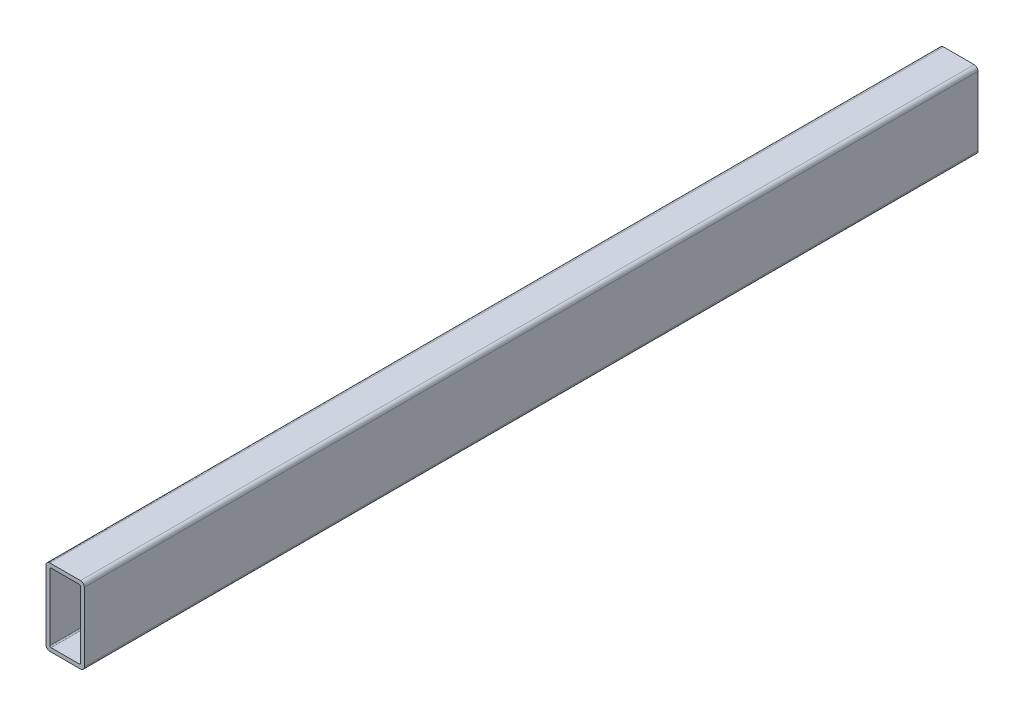
ISO-10303-21;
HEADER;
FILE_DESCRIPTION(('STEP AP214'),'2;1');
FILE_NAME('part.step','',(''),(''),'','','');
FILE_SCHEMA(('AUTOMOTIVE_DESIGN { 1 0 10303 214 1 1 1 1 }'));
ENDSEC;
DATA;
#1=APPLICATION_CONTEXT('core data for automotive mechanical design processes');
#2=APPLICATION_PROTOCOL_DEFINITION('international standard','automotive_design',2000,#1);
#3=PRODUCT_CONTEXT('',#1,'mechanical');
#4=PRODUCT('Part','Part','',(#3));
#5=PRODUCT_RELATED_PRODUCT_CATEGORY('part','',(#4));
#6=PRODUCT_DEFINITION_FORMATION('','',#4);
#7=PRODUCT_DEFINITION_CONTEXT('part definition',#1,'design');
#8=PRODUCT_DEFINITION('design','',#6,#7);
#9=PRODUCT_DEFINITION_SHAPE('','',#8);
#10=(LENGTH_UNIT() NAMED_UNIT(*) SI_UNIT(.MILLI.,.METRE.));
#11=(NAMED_UNIT(*) PLANE_ANGLE_UNIT() SI_UNIT($,.RADIAN.));
#12=(NAMED_UNIT(*) SI_UNIT($,.STERADIAN.) SOLID_ANGLE_UNIT());
#13=UNCERTAINTY_MEASURE_WITH_UNIT(LENGTH_MEASURE(1.E-05),#10,'distance_accuracy_value','');
#14=(GEOMETRIC_REPRESENTATION_CONTEXT(3) GLOBAL_UNCERTAINTY_ASSIGNED_CONTEXT((#13)) GLOBAL_UNIT_ASSIGNED_CONTEXT((#10,
#11,#12)) REPRESENTATION_CONTEXT('',''));
#15=CARTESIAN_POINT('',(0.,0.,0.));
#16=DIRECTION('',(0.,0.,1.));
#17=DIRECTION('',(1.,0.,0.));
#18=AXIS2_PLACEMENT_3D('',#15,#16,#17);
#19=CARTESIAN_POINT('',(12.,-2.99999999999999,-700.));
#20=DIRECTION('',(0.,0.,1.));
#21=DIRECTION('',(1.,0.,0.));
#22=AXIS2_PLACEMENT_3D('',#19,#20,#21);
#23=CYLINDRICAL_SURFACE('',#22,2.99999999999999);
#24=CARTESIAN_POINT('',(12.,-2.99999999999999,0.));
#25=DIRECTION('',(0.,0.,1.));
#26=DIRECTION('',(-1.,0.,0.));
#27=AXIS2_PLACEMENT_3D('',#24,#25,#26);
#28=CIRCLE('',#27,2.99999999999999);
#29=CARTESIAN_POINT('',(15.,-2.99999999999999,0.));
#30=VERTEX_POINT('',#29);
#31=CARTESIAN_POINT('',(12.,0.,0.));
#32=VERTEX_POINT('',#31);
#33=EDGE_CURVE('E227',#30,#32,#28,.T.);
#34=ORIENTED_EDGE('',*,*,#33,.F.);
#35=DIRECTION('',(0.,0.,1.));
#36=VECTOR('',#35,1.);
#37=CARTESIAN_POINT('',(15.,-2.99999999999999,-700.));
#38=LINE('',#37,#36);
#39=CARTESIAN_POINT('',(15.,-2.99999999999999,-700.));
#40=VERTEX_POINT('',#39);
#41=EDGE_CURVE('E11',#40,#30,#38,.T.);
#42=ORIENTED_EDGE('',*,*,#41,.F.);
#43=CARTESIAN_POINT('',(12.,-2.99999999999999,-700.));
#44=DIRECTION('',(0.,0.,1.));
#45=DIRECTION('',(-1.,0.,0.));
#46=AXIS2_PLACEMENT_3D('',#43,#44,#45);
#47=CIRCLE('',#46,2.99999999999999);
#48=CARTESIAN_POINT('',(12.,0.,-700.));
#49=VERTEX_POINT('',#48);
#50=EDGE_CURVE('E245',#40,#49,#47,.T.);
#51=ORIENTED_EDGE('',*,*,#50,.T.);
#52=DIRECTION('',(0.,0.,1.));
#53=VECTOR('',#52,1.);
#54=CARTESIAN_POINT('',(12.,0.,-700.));
#55=LINE('',#54,#53);
#56=EDGE_CURVE('E41',#49,#32,#55,.T.);
#57=ORIENTED_EDGE('',*,*,#56,.T.);
#58=EDGE_LOOP('',(#34,#42,#51,#57));
#59=FACE_BOUND('',#58,.T.);
#60=ADVANCED_FACE('F38',(#59),#23,.T.);
#61=CARTESIAN_POINT('',(15.,-57.,-700.));
#62=DIRECTION('',(1.,0.,0.));
#63=DIRECTION('',(0.,0.,-1.));
#64=AXIS2_PLACEMENT_3D('',#61,#62,#63);
#65=PLANE('',#64);
#66=DIRECTION('',(0.,1.,0.));
#67=VECTOR('',#66,1.);
#68=CARTESIAN_POINT('',(15.,-57.,0.));
#69=LINE('',#68,#67);
#70=CARTESIAN_POINT('',(15.,-57.,0.));
#71=VERTEX_POINT('',#70);
#72=EDGE_CURVE('E250',#71,#30,#69,.T.);
#73=ORIENTED_EDGE('',*,*,#72,.F.);
#74=DIRECTION('',(0.,0.,1.));
#75=VECTOR('',#74,1.);
#76=CARTESIAN_POINT('',(15.,-57.,-700.));
#77=LINE('',#76,#75);
#78=CARTESIAN_POINT('',(15.,-57.,-700.));
#79=VERTEX_POINT('',#78);
#80=EDGE_CURVE('E47',#79,#71,#77,.T.);
#81=ORIENTED_EDGE('',*,*,#80,.F.);
#82=DIRECTION('',(0.,1.,0.));
#83=VECTOR('',#82,1.);
#84=CARTESIAN_POINT('',(15.,-57.,-700.));
#85=LINE('',#84,#83);
#86=EDGE_CURVE('E274',#79,#40,#85,.T.);
#87=ORIENTED_EDGE('',*,*,#86,.T.);
#88=ORIENTED_EDGE('',*,*,#41,.T.);
#89=EDGE_LOOP('',(#73,#81,#87,#88));
#90=FACE_BOUND('',#89,.T.);
#91=ADVANCED_FACE('F337',(#90),#65,.T.);
#92=CARTESIAN_POINT('',(12.,-57.,-700.));
#93=DIRECTION('',(0.,0.,1.));
#94=DIRECTION('',(1.,0.,0.));
#95=AXIS2_PLACEMENT_3D('',#92,#93,#94);
#96=CYLINDRICAL_SURFACE('',#95,3.);
#97=CARTESIAN_POINT('',(12.,-57.,0.));
#98=DIRECTION('',(0.,0.,1.));
#99=DIRECTION('',(-1.,0.,0.));
#100=AXIS2_PLACEMENT_3D('',#97,#98,#99);
#101=CIRCLE('',#100,3.);
#102=CARTESIAN_POINT('',(12.,-60.,0.));
#103=VERTEX_POINT('',#102);
#104=EDGE_CURVE('E301',#103,#71,#101,.T.);
#105=ORIENTED_EDGE('',*,*,#104,.F.);
#106=DIRECTION('',(0.,0.,1.));
#107=VECTOR('',#106,1.);
#108=CARTESIAN_POINT('',(12.,-60.,-700.));
#109=LINE('',#108,#107);
#110=CARTESIAN_POINT('',(12.,-60.,-700.));
#111=VERTEX_POINT('',#110);
#112=EDGE_CURVE('E310',#111,#103,#109,.T.);
#113=ORIENTED_EDGE('',*,*,#112,.F.);
#114=CARTESIAN_POINT('',(12.,-57.,-700.));
#115=DIRECTION('',(0.,0.,1.));
#116=DIRECTION('',(-1.,0.,0.));
#117=AXIS2_PLACEMENT_3D('',#114,#115,#116);
#118=CIRCLE('',#117,3.);
#119=EDGE_CURVE('E270',#111,#79,#118,.T.);
#120=ORIENTED_EDGE('',*,*,#119,.T.);
#121=ORIENTED_EDGE('',*,*,#80,.T.);
#122=EDGE_LOOP('',(#105,#113,#120,#121));
#123=FACE_BOUND('',#122,.T.);
#124=ADVANCED_FACE('F356',(#123),#96,.T.);
#125=CARTESIAN_POINT('',(-12.,-60.,-700.));
#126=DIRECTION('',(0.,-1.,0.));
#127=DIRECTION('',(0.,0.,-1.));
#128=AXIS2_PLACEMENT_3D('',#125,#126,#127);
#129=PLANE('',#128);
#130=DIRECTION('',(1.,0.,0.));
#131=VECTOR('',#130,1.);
#132=CARTESIAN_POINT('',(-12.,-60.,0.));
#133=LINE('',#132,#131);
#134=CARTESIAN_POINT('',(-12.,-60.,0.));
#135=VERTEX_POINT('',#134);
#136=EDGE_CURVE('E297',#135,#103,#133,.T.);
#137=ORIENTED_EDGE('',*,*,#136,.F.);
#138=DIRECTION('',(0.,0.,1.));
#139=VECTOR('',#138,1.);
#140=CARTESIAN_POINT('',(-12.,-60.,-700.));
#141=LINE('',#140,#139);
#142=CARTESIAN_POINT('',(-12.,-60.,-700.));
#143=VERTEX_POINT('',#142);
#144=EDGE_CURVE('E313',#143,#135,#141,.T.);
#145=ORIENTED_EDGE('',*,*,#144,.F.);
#146=DIRECTION('',(1.,0.,0.));
#147=VECTOR('',#146,1.);
#148=CARTESIAN_POINT('',(-12.,-60.,-700.));
#149=LINE('',#148,#147);
#150=EDGE_CURVE('E266',#143,#111,#149,.T.);
#151=ORIENTED_EDGE('',*,*,#150,.T.);
#152=ORIENTED_EDGE('',*,*,#112,.T.);
#153=EDGE_LOOP('',(#137,#145,#151,#152));
#154=FACE_BOUND('',#153,.T.);
#155=ADVANCED_FACE('F354',(#154),#129,.T.);
#156=CARTESIAN_POINT('',(-12.,-57.,-700.));
#157=DIRECTION('',(0.,0.,1.));
#158=DIRECTION('',(1.,0.,0.));
#159=AXIS2_PLACEMENT_3D('',#156,#157,#158);
#160=CYLINDRICAL_SURFACE('',#159,3.);
#161=CARTESIAN_POINT('',(-12.,-57.,0.));
#162=DIRECTION('',(0.,0.,1.));
#163=DIRECTION('',(-1.,0.,0.));
#164=AXIS2_PLACEMENT_3D('',#161,#162,#163);
#165=CIRCLE('',#164,3.);
#166=CARTESIAN_POINT('',(-15.,-57.,0.));
#167=VERTEX_POINT('',#166);
#168=EDGE_CURVE('E293',#167,#135,#165,.T.);
#169=ORIENTED_EDGE('',*,*,#168,.F.);
#170=DIRECTION('',(0.,0.,1.));
#171=VECTOR('',#170,1.);
#172=CARTESIAN_POINT('',(-15.,-57.,-700.));
#173=LINE('',#172,#171);
#174=CARTESIAN_POINT('',(-15.,-57.,-700.));
#175=VERTEX_POINT('',#174);
#176=EDGE_CURVE('E316',#175,#167,#173,.T.);
#177=ORIENTED_EDGE('',*,*,#176,.F.);
#178=CARTESIAN_POINT('',(-12.,-57.,-700.));
#179=DIRECTION('',(0.,0.,1.));
#180=DIRECTION('',(-1.,0.,0.));
#181=AXIS2_PLACEMENT_3D('',#178,#179,#180);
#182=CIRCLE('',#181,3.);
#183=EDGE_CURVE('E262',#175,#143,#182,.T.);
#184=ORIENTED_EDGE('',*,*,#183,.T.);
#185=ORIENTED_EDGE('',*,*,#144,.T.);
#186=EDGE_LOOP('',(#169,#177,#184,#185));
#187=FACE_BOUND('',#186,.T.);
#188=ADVANCED_FACE('F350',(#187),#160,.T.);
#189=CARTESIAN_POINT('',(-15.,-57.,-700.));
#190=DIRECTION('',(-1.,0.,0.));
#191=DIRECTION('',(0.,-1.,0.));
#192=AXIS2_PLACEMENT_3D('',#189,#190,#191);
#193=PLANE('',#192);
#194=DIRECTION('',(0.,-1.,0.));
#195=VECTOR('',#194,1.);
#196=CARTESIAN_POINT('',(-15.,-57.,0.));
#197=LINE('',#196,#195);
#198=CARTESIAN_POINT('',(-15.,-2.99999999999999,0.));
#199=VERTEX_POINT('',#198);
#200=EDGE_CURVE('E289',#199,#167,#197,.T.);
#201=ORIENTED_EDGE('',*,*,#200,.F.);
#202=DIRECTION('',(0.,0.,1.));
#203=VECTOR('',#202,1.);
#204=CARTESIAN_POINT('',(-15.,-2.99999999999999,-700.));
#205=LINE('',#204,#203);
#206=CARTESIAN_POINT('',(-15.,-2.99999999999999,-700.));
#207=VERTEX_POINT('',#206);
#208=EDGE_CURVE('E319',#207,#199,#205,.T.);
#209=ORIENTED_EDGE('',*,*,#208,.F.);
#210=DIRECTION('',(0.,-1.,0.));
#211=VECTOR('',#210,1.);
#212=CARTESIAN_POINT('',(-15.,-57.,-700.));
#213=LINE('',#212,#211);
#214=EDGE_CURVE('E258',#207,#175,#213,.T.);
#215=ORIENTED_EDGE('',*,*,#214,.T.);
#216=ORIENTED_EDGE('',*,*,#176,.T.);
#217=EDGE_LOOP('',(#201,#209,#215,#216));
#218=FACE_BOUND('',#217,.T.);
#219=ADVANCED_FACE('F348',(#218),#193,.T.);
#220=CARTESIAN_POINT('',(-12.,-2.99999999999999,-700.));
#221=DIRECTION('',(0.,0.,1.));
#222=DIRECTION('',(1.,0.,0.));
#223=AXIS2_PLACEMENT_3D('',#220,#221,#222);
#224=CYLINDRICAL_SURFACE('',#223,2.99999999999999);
#225=CARTESIAN_POINT('',(-12.,-2.99999999999999,0.));
#226=DIRECTION('',(0.,0.,1.));
#227=DIRECTION('',(-1.,0.,0.));
#228=AXIS2_PLACEMENT_3D('',#225,#226,#227);
#229=CIRCLE('',#228,2.99999999999999);
#230=CARTESIAN_POINT('',(-12.,0.,0.));
#231=VERTEX_POINT('',#230);
#232=EDGE_CURVE('E285',#231,#199,#229,.T.);
#233=ORIENTED_EDGE('',*,*,#232,.F.);
#234=DIRECTION('',(0.,0.,1.));
#235=VECTOR('',#234,1.);
#236=CARTESIAN_POINT('',(-12.,0.,-700.));
#237=LINE('',#236,#235);
#238=CARTESIAN_POINT('',(-12.,0.,-700.));
#239=VERTEX_POINT('',#238);
#240=EDGE_CURVE('E321',#239,#231,#237,.T.);
#241=ORIENTED_EDGE('',*,*,#240,.F.);
#242=CARTESIAN_POINT('',(-12.,-2.99999999999999,-700.));
#243=DIRECTION('',(0.,0.,1.));
#244=DIRECTION('',(-1.,0.,0.));
#245=AXIS2_PLACEMENT_3D('',#242,#243,#244);
#246=CIRCLE('',#245,2.99999999999999);
#247=EDGE_CURVE('E254',#239,#207,#246,.T.);
#248=ORIENTED_EDGE('',*,*,#247,.T.);
#249=ORIENTED_EDGE('',*,*,#208,.T.);
#250=EDGE_LOOP('',(#233,#241,#248,#249));
#251=FACE_BOUND('',#250,.T.);
#252=ADVANCED_FACE('F344',(#251),#224,.T.);
#253=CARTESIAN_POINT('',(-12.,0.,-700.));
#254=DIRECTION('',(0.,1.,0.));
#255=DIRECTION('',(0.,0.,1.));
#256=AXIS2_PLACEMENT_3D('',#253,#254,#255);
#257=PLANE('',#256);
#258=DIRECTION('',(-1.,0.,0.));
#259=VECTOR('',#258,1.);
#260=CARTESIAN_POINT('',(-12.,0.,0.));
#261=LINE('',#260,#259);
#262=EDGE_CURVE('E281',#32,#231,#261,.T.);
#263=ORIENTED_EDGE('',*,*,#262,.F.);
#264=ORIENTED_EDGE('',*,*,#56,.F.);
#265=DIRECTION('',(-1.,0.,0.));
#266=VECTOR('',#265,1.);
#267=CARTESIAN_POINT('',(-12.,0.,-700.));
#268=LINE('',#267,#266);
#269=EDGE_CURVE('E249',#49,#239,#268,.T.);
#270=ORIENTED_EDGE('',*,*,#269,.T.);
#271=ORIENTED_EDGE('',*,*,#240,.T.);
#272=EDGE_LOOP('',(#263,#264,#270,#271));
#273=FACE_BOUND('',#272,.T.);
#274=ADVANCED_FACE('F331',(#273),#257,.T.);
#275=CARTESIAN_POINT('',(12.,-2.99999999999999,-700.));
#276=DIRECTION('',(0.,0.,-1.));
#277=DIRECTION('',(-1.,0.,0.));
#278=AXIS2_PLACEMENT_3D('',#275,#276,#277);
#279=PLANE('',#278);
#280=CARTESIAN_POINT('',(11.,-4.,-700.));
#281=DIRECTION('',(0.,0.,1.));
#282=DIRECTION('',(-1.,0.,0.));
#283=AXIS2_PLACEMENT_3D('',#280,#281,#282);
#284=CIRCLE('',#283,1.);
#285=CARTESIAN_POINT('',(12.,-4.,-700.));
#286=VERTEX_POINT('',#285);
#287=CARTESIAN_POINT('',(11.,-3.,-700.));
#288=VERTEX_POINT('',#287);
#289=EDGE_CURVE('E154',#286,#288,#284,.T.);
#290=ORIENTED_EDGE('',*,*,#289,.T.);
#291=DIRECTION('',(-1.,0.,0.));
#292=VECTOR('',#291,1.);
#293=CARTESIAN_POINT('',(-11.,-3.,-700.));
#294=LINE('',#293,#292);
#295=CARTESIAN_POINT('',(-11.,-3.,-700.));
#296=VERTEX_POINT('',#295);
#297=EDGE_CURVE('E164',#288,#296,#294,.T.);
#298=ORIENTED_EDGE('',*,*,#297,.T.);
#299=CARTESIAN_POINT('',(-11.,-4.,-700.));
#300=DIRECTION('',(0.,0.,1.));
#301=DIRECTION('',(-1.,0.,0.));
#302=AXIS2_PLACEMENT_3D('',#299,#300,#301);
#303=CIRCLE('',#302,1.);
#304=CARTESIAN_POINT('',(-12.,-4.,-700.));
#305=VERTEX_POINT('',#304);
#306=EDGE_CURVE('E55',#296,#305,#303,.T.);
#307=ORIENTED_EDGE('',*,*,#306,.T.);
#308=DIRECTION('',(0.,-1.,0.));
#309=VECTOR('',#308,1.);
#310=CARTESIAN_POINT('',(-12.,-56.,-700.));
#311=LINE('',#310,#309);
#312=CARTESIAN_POINT('',(-12.,-56.,-700.));
#313=VERTEX_POINT('',#312);
#314=EDGE_CURVE('E183',#305,#313,#311,.T.);
#315=ORIENTED_EDGE('',*,*,#314,.T.);
#316=CARTESIAN_POINT('',(-11.,-56.,-700.));
#317=DIRECTION('',(0.,0.,1.));
#318=DIRECTION('',(-1.,0.,0.));
#319=AXIS2_PLACEMENT_3D('',#316,#317,#318);
#320=CIRCLE('',#319,1.);
#321=CARTESIAN_POINT('',(-11.,-57.,-700.));
#322=VERTEX_POINT('',#321);
#323=EDGE_CURVE('E187',#313,#322,#320,.T.);
#324=ORIENTED_EDGE('',*,*,#323,.T.);
#325=DIRECTION('',(1.,0.,0.));
#326=VECTOR('',#325,1.);
#327=CARTESIAN_POINT('',(-11.,-57.,-700.));
#328=LINE('',#327,#326);
#329=CARTESIAN_POINT('',(11.,-57.,-700.));
#330=VERTEX_POINT('',#329);
#331=EDGE_CURVE('E191',#322,#330,#328,.T.);
#332=ORIENTED_EDGE('',*,*,#331,.T.);
#333=CARTESIAN_POINT('',(11.,-56.,-700.));
#334=DIRECTION('',(0.,0.,1.));
#335=DIRECTION('',(-1.,0.,0.));
#336=AXIS2_PLACEMENT_3D('',#333,#334,#335);
#337=CIRCLE('',#336,1.);
#338=CARTESIAN_POINT('',(12.,-56.,-700.));
#339=VERTEX_POINT('',#338);
#340=EDGE_CURVE('E195',#330,#339,#337,.T.);
#341=ORIENTED_EDGE('',*,*,#340,.T.);
#342=DIRECTION('',(0.,1.,0.));
#343=VECTOR('',#342,1.);
#344=CARTESIAN_POINT('',(12.,-56.,-700.));
#345=LINE('',#344,#343);
#346=EDGE_CURVE('E161',#339,#286,#345,.T.);
#347=ORIENTED_EDGE('',*,*,#346,.T.);
#348=EDGE_LOOP('',(#290,#298,#307,#315,#324,#332,#341,#347));
#349=FACE_BOUND('',#348,.T.);
#350=ORIENTED_EDGE('',*,*,#50,.F.);
#351=ORIENTED_EDGE('',*,*,#86,.F.);
#352=ORIENTED_EDGE('',*,*,#119,.F.);
#353=ORIENTED_EDGE('',*,*,#150,.F.);
#354=ORIENTED_EDGE('',*,*,#183,.F.);
#355=ORIENTED_EDGE('',*,*,#214,.F.);
#356=ORIENTED_EDGE('',*,*,#247,.F.);
#357=ORIENTED_EDGE('',*,*,#269,.F.);
#358=EDGE_LOOP('',(#350,#351,#352,#353,#354,#355,#356,#357));
#359=FACE_BOUND('',#358,.T.);
#360=ADVANCED_FACE('F169',(#349,#359),#279,.T.);
#361=CARTESIAN_POINT('',(12.,-2.99999999999999,0.));
#362=DIRECTION('',(0.,0.,-1.));
#363=DIRECTION('',(-1.,0.,0.));
#364=AXIS2_PLACEMENT_3D('',#361,#362,#363);
#365=PLANE('',#364);
#366=DIRECTION('',(-1.,0.,0.));
#367=VECTOR('',#366,1.);
#368=CARTESIAN_POINT('',(-11.,-3.,0.));
#369=LINE('',#368,#367);
#370=CARTESIAN_POINT('',(11.,-3.,0.));
#371=VERTEX_POINT('',#370);
#372=CARTESIAN_POINT('',(-11.,-3.,0.));
#373=VERTEX_POINT('',#372);
#374=EDGE_CURVE('E202',#371,#373,#369,.T.);
#375=ORIENTED_EDGE('',*,*,#374,.F.);
#376=CARTESIAN_POINT('',(11.,-4.,0.));
#377=DIRECTION('',(0.,0.,1.));
#378=DIRECTION('',(-1.,0.,0.));
#379=AXIS2_PLACEMENT_3D('',#376,#377,#378);
#380=CIRCLE('',#379,1.);
#381=CARTESIAN_POINT('',(12.,-4.,0.));
#382=VERTEX_POINT('',#381);
#383=EDGE_CURVE('E63',#382,#371,#380,.T.);
#384=ORIENTED_EDGE('',*,*,#383,.F.);
#385=DIRECTION('',(0.,1.,0.));
#386=VECTOR('',#385,1.);
#387=CARTESIAN_POINT('',(12.,-56.,0.));
#388=LINE('',#387,#386);
#389=CARTESIAN_POINT('',(12.,-56.,0.));
#390=VERTEX_POINT('',#389);
#391=EDGE_CURVE('E174',#390,#382,#388,.T.);
#392=ORIENTED_EDGE('',*,*,#391,.F.);
#393=CARTESIAN_POINT('',(11.,-56.,0.));
#394=DIRECTION('',(0.,0.,1.));
#395=DIRECTION('',(-1.,0.,0.));
#396=AXIS2_PLACEMENT_3D('',#393,#394,#395);
#397=CIRCLE('',#396,1.);
#398=CARTESIAN_POINT('',(11.,-57.,0.));
#399=VERTEX_POINT('',#398);
#400=EDGE_CURVE('E178',#399,#390,#397,.T.);
#401=ORIENTED_EDGE('',*,*,#400,.F.);
#402=DIRECTION('',(1.,0.,0.));
#403=VECTOR('',#402,1.);
#404=CARTESIAN_POINT('',(-11.,-57.,0.));
#405=LINE('',#404,#403);
#406=CARTESIAN_POINT('',(-11.,-57.,0.));
#407=VERTEX_POINT('',#406);
#408=EDGE_CURVE('E217',#407,#399,#405,.T.);
#409=ORIENTED_EDGE('',*,*,#408,.F.);
#410=CARTESIAN_POINT('',(-11.,-56.,0.));
#411=DIRECTION('',(0.,0.,1.));
#412=DIRECTION('',(-1.,0.,0.));
#413=AXIS2_PLACEMENT_3D('',#410,#411,#412);
#414=CIRCLE('',#413,1.);
#415=CARTESIAN_POINT('',(-12.,-56.,0.));
#416=VERTEX_POINT('',#415);
#417=EDGE_CURVE('E213',#416,#407,#414,.T.);
#418=ORIENTED_EDGE('',*,*,#417,.F.);
#419=DIRECTION('',(0.,-1.,0.));
#420=VECTOR('',#419,1.);
#421=CARTESIAN_POINT('',(-12.,-56.,0.));
#422=LINE('',#421,#420);
#423=CARTESIAN_POINT('',(-12.,-4.,0.));
#424=VERTEX_POINT('',#423);
#425=EDGE_CURVE('E209',#424,#416,#422,.T.);
#426=ORIENTED_EDGE('',*,*,#425,.F.);
#427=CARTESIAN_POINT('',(-11.,-4.,0.));
#428=DIRECTION('',(0.,0.,1.));
#429=DIRECTION('',(-1.,0.,0.));
#430=AXIS2_PLACEMENT_3D('',#427,#428,#429);
#431=CIRCLE('',#430,1.);
#432=EDGE_CURVE('E205',#373,#424,#431,.T.);
#433=ORIENTED_EDGE('',*,*,#432,.F.);
#434=EDGE_LOOP('',(#375,#384,#392,#401,#409,#418,#426,#433));
#435=FACE_BOUND('',#434,.T.);
#436=ORIENTED_EDGE('',*,*,#33,.T.);
#437=ORIENTED_EDGE('',*,*,#262,.T.);
#438=ORIENTED_EDGE('',*,*,#232,.T.);
#439=ORIENTED_EDGE('',*,*,#200,.T.);
#440=ORIENTED_EDGE('',*,*,#168,.T.);
#441=ORIENTED_EDGE('',*,*,#136,.T.);
#442=ORIENTED_EDGE('',*,*,#104,.T.);
#443=ORIENTED_EDGE('',*,*,#72,.T.);
#444=EDGE_LOOP('',(#436,#437,#438,#439,#440,#441,#442,#443));
#445=FACE_BOUND('',#444,.T.);
#446=ADVANCED_FACE('F333',(#435,#445),#365,.F.);
#447=CARTESIAN_POINT('',(11.,-4.,-700.));
#448=DIRECTION('',(0.,0.,1.));
#449=DIRECTION('',(1.,0.,0.));
#450=AXIS2_PLACEMENT_3D('',#447,#448,#449);
#451=CYLINDRICAL_SURFACE('',#450,1.);
#452=ORIENTED_EDGE('',*,*,#383,.T.);
#453=DIRECTION('',(0.,0.,1.));
#454=VECTOR('',#453,1.);
#455=CARTESIAN_POINT('',(11.,-3.,-700.));
#456=LINE('',#455,#454);
#457=EDGE_CURVE('E150',#288,#371,#456,.T.);
#458=ORIENTED_EDGE('',*,*,#457,.F.);
#459=ORIENTED_EDGE('',*,*,#289,.F.);
#460=DIRECTION('',(0.,0.,1.));
#461=VECTOR('',#460,1.);
#462=CARTESIAN_POINT('',(12.,-4.,-700.));
#463=LINE('',#462,#461);
#464=EDGE_CURVE('E224',#286,#382,#463,.T.);
#465=ORIENTED_EDGE('',*,*,#464,.T.);
#466=EDGE_LOOP('',(#452,#458,#459,#465));
#467=FACE_BOUND('',#466,.T.);
#468=ADVANCED_FACE('F152',(#467),#451,.F.);
#469=CARTESIAN_POINT('',(12.,-56.,-700.));
#470=DIRECTION('',(1.,0.,0.));
#471=DIRECTION('',(0.,1.,0.));
#472=AXIS2_PLACEMENT_3D('',#469,#470,#471);
#473=PLANE('',#472);
#474=ORIENTED_EDGE('',*,*,#391,.T.);
#475=ORIENTED_EDGE('',*,*,#464,.F.);
#476=ORIENTED_EDGE('',*,*,#346,.F.);
#477=DIRECTION('',(0.,0.,1.));
#478=VECTOR('',#477,1.);
#479=CARTESIAN_POINT('',(12.,-56.,-700.));
#480=LINE('',#479,#478);
#481=EDGE_CURVE('E228',#339,#390,#480,.T.);
#482=ORIENTED_EDGE('',*,*,#481,.T.);
#483=EDGE_LOOP('',(#474,#475,#476,#482));
#484=FACE_BOUND('',#483,.T.);
#485=ADVANCED_FACE('F439',(#484),#473,.F.);
#486=CARTESIAN_POINT('',(11.,-56.,-700.));
#487=DIRECTION('',(0.,0.,1.));
#488=DIRECTION('',(1.,0.,0.));
#489=AXIS2_PLACEMENT_3D('',#486,#487,#488);
#490=CYLINDRICAL_SURFACE('',#489,1.);
#491=ORIENTED_EDGE('',*,*,#400,.T.);
#492=ORIENTED_EDGE('',*,*,#481,.F.);
#493=ORIENTED_EDGE('',*,*,#340,.F.);
#494=DIRECTION('',(0.,0.,1.));
#495=VECTOR('',#494,1.);
#496=CARTESIAN_POINT('',(11.,-57.,-700.));
#497=LINE('',#496,#495);
#498=EDGE_CURVE('E231',#330,#399,#497,.T.);
#499=ORIENTED_EDGE('',*,*,#498,.T.);
#500=EDGE_LOOP('',(#491,#492,#493,#499));
#501=FACE_BOUND('',#500,.T.);
#502=ADVANCED_FACE('F448',(#501),#490,.F.);
#503=CARTESIAN_POINT('',(-11.,-57.,-700.));
#504=DIRECTION('',(0.,-1.,0.));
#505=DIRECTION('',(0.,0.,-1.));
#506=AXIS2_PLACEMENT_3D('',#503,#504,#505);
#507=PLANE('',#506);
#508=ORIENTED_EDGE('',*,*,#408,.T.);
#509=ORIENTED_EDGE('',*,*,#498,.F.);
#510=ORIENTED_EDGE('',*,*,#331,.F.);
#511=DIRECTION('',(0.,0.,1.));
#512=VECTOR('',#511,1.);
#513=CARTESIAN_POINT('',(-11.,-57.,-700.));
#514=LINE('',#513,#512);
#515=EDGE_CURVE('E234',#322,#407,#514,.T.);
#516=ORIENTED_EDGE('',*,*,#515,.T.);
#517=EDGE_LOOP('',(#508,#509,#510,#516));
#518=FACE_BOUND('',#517,.T.);
#519=ADVANCED_FACE('F458',(#518),#507,.F.);
#520=CARTESIAN_POINT('',(-11.,-56.,-700.));
#521=DIRECTION('',(0.,0.,1.));
#522=DIRECTION('',(1.,0.,0.));
#523=AXIS2_PLACEMENT_3D('',#520,#521,#522);
#524=CYLINDRICAL_SURFACE('',#523,1.);
#525=ORIENTED_EDGE('',*,*,#417,.T.);
#526=ORIENTED_EDGE('',*,*,#515,.F.);
#527=ORIENTED_EDGE('',*,*,#323,.F.);
#528=DIRECTION('',(0.,0.,1.));
#529=VECTOR('',#528,1.);
#530=CARTESIAN_POINT('',(-12.,-56.,-700.));
#531=LINE('',#530,#529);
#532=EDGE_CURVE('E237',#313,#416,#531,.T.);
#533=ORIENTED_EDGE('',*,*,#532,.T.);
#534=EDGE_LOOP('',(#525,#526,#527,#533));
#535=FACE_BOUND('',#534,.T.);
#536=ADVANCED_FACE('F468',(#535),#524,.F.);
#537=CARTESIAN_POINT('',(-12.,-56.,-700.));
#538=DIRECTION('',(-1.,0.,0.));
#539=DIRECTION('',(0.,-1.,0.));
#540=AXIS2_PLACEMENT_3D('',#537,#538,#539);
#541=PLANE('',#540);
#542=ORIENTED_EDGE('',*,*,#425,.T.);
#543=ORIENTED_EDGE('',*,*,#532,.F.);
#544=ORIENTED_EDGE('',*,*,#314,.F.);
#545=DIRECTION('',(0.,0.,1.));
#546=VECTOR('',#545,1.);
#547=CARTESIAN_POINT('',(-12.,-4.,-700.));
#548=LINE('',#547,#546);
#549=EDGE_CURVE('E240',#305,#424,#548,.T.);
#550=ORIENTED_EDGE('',*,*,#549,.T.);
#551=EDGE_LOOP('',(#542,#543,#544,#550));
#552=FACE_BOUND('',#551,.T.);
#553=ADVANCED_FACE('F478',(#552),#541,.F.);
#554=CARTESIAN_POINT('',(-11.,-4.,-700.));
#555=DIRECTION('',(0.,0.,1.));
#556=DIRECTION('',(1.,0.,0.));
#557=AXIS2_PLACEMENT_3D('',#554,#555,#556);
#558=CYLINDRICAL_SURFACE('',#557,1.);
#559=ORIENTED_EDGE('',*,*,#432,.T.);
#560=ORIENTED_EDGE('',*,*,#549,.F.);
#561=ORIENTED_EDGE('',*,*,#306,.F.);
#562=DIRECTION('',(0.,0.,1.));
#563=VECTOR('',#562,1.);
#564=CARTESIAN_POINT('',(-11.,-3.,-700.));
#565=LINE('',#564,#563);
#566=EDGE_CURVE('E160',#296,#373,#565,.T.);
#567=ORIENTED_EDGE('',*,*,#566,.T.);
#568=EDGE_LOOP('',(#559,#560,#561,#567));
#569=FACE_BOUND('',#568,.T.);
#570=ADVANCED_FACE('F488',(#569),#558,.F.);
#571=CARTESIAN_POINT('',(-11.,-3.,-700.));
#572=DIRECTION('',(0.,1.,0.));
#573=DIRECTION('',(0.,0.,1.));
#574=AXIS2_PLACEMENT_3D('',#571,#572,#573);
#575=PLANE('',#574);
#576=ORIENTED_EDGE('',*,*,#374,.T.);
#577=ORIENTED_EDGE('',*,*,#566,.F.);
#578=ORIENTED_EDGE('',*,*,#297,.F.);
#579=ORIENTED_EDGE('',*,*,#457,.T.);
#580=EDGE_LOOP('',(#576,#577,#578,#579));
#581=FACE_BOUND('',#580,.T.);
#582=ADVANCED_FACE('F165',(#581),#575,.F.);
#583=CLOSED_SHELL('',(#60,#91,#124,#155,#188,#219,#252,#274,#360,#446,#468,#485,#502,#519,#536,
#553,#570,#582));
#584=MANIFOLD_SOLID_BREP('B2',#583);
#585=ADVANCED_BREP_SHAPE_REPRESENTATION('',(#18,#584),#14);
#586=SHAPE_DEFINITION_REPRESENTATION(#9,#585);
ENDSEC;
END-ISO-10303-21;
